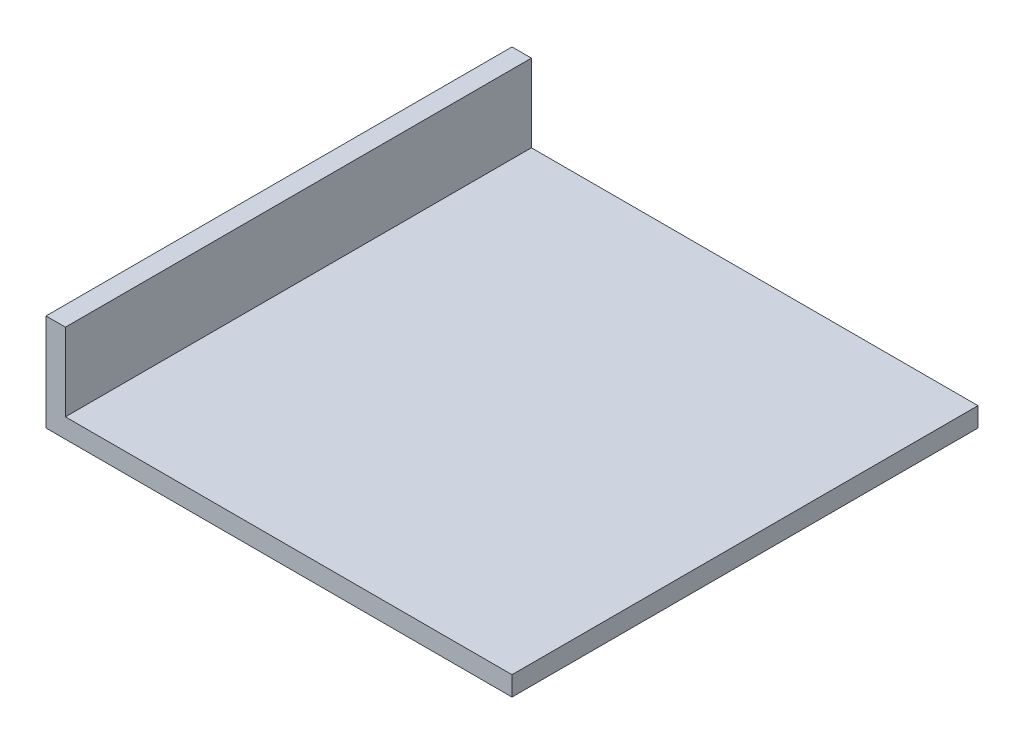
ISO-10303-21;
HEADER;
FILE_DESCRIPTION(('STEP AP214'),'2;1');
FILE_NAME('part.step','',(''),(''),'','','');
FILE_SCHEMA(('AUTOMOTIVE_DESIGN { 1 0 10303 214 1 1 1 1 }'));
ENDSEC;
DATA;
#1=APPLICATION_CONTEXT('core data for automotive mechanical design processes');
#2=APPLICATION_PROTOCOL_DEFINITION('international standard','automotive_design',2000,#1);
#3=PRODUCT_CONTEXT('',#1,'mechanical');
#4=PRODUCT('Part','Part','',(#3));
#5=PRODUCT_RELATED_PRODUCT_CATEGORY('part','',(#4));
#6=PRODUCT_DEFINITION_FORMATION('','',#4);
#7=PRODUCT_DEFINITION_CONTEXT('part definition',#1,'design');
#8=PRODUCT_DEFINITION('design','',#6,#7);
#9=PRODUCT_DEFINITION_SHAPE('','',#8);
#10=(LENGTH_UNIT() NAMED_UNIT(*) SI_UNIT(.MILLI.,.METRE.));
#11=(NAMED_UNIT(*) PLANE_ANGLE_UNIT() SI_UNIT($,.RADIAN.));
#12=(NAMED_UNIT(*) SI_UNIT($,.STERADIAN.) SOLID_ANGLE_UNIT());
#13=UNCERTAINTY_MEASURE_WITH_UNIT(LENGTH_MEASURE(1.E-05),#10,'distance_accuracy_value','');
#14=(GEOMETRIC_REPRESENTATION_CONTEXT(3) GLOBAL_UNCERTAINTY_ASSIGNED_CONTEXT((#13)) GLOBAL_UNIT_ASSIGNED_CONTEXT((#10,
#11,#12)) REPRESENTATION_CONTEXT('',''));
#15=CARTESIAN_POINT('',(0.,0.,0.));
#16=DIRECTION('',(0.,0.,1.));
#17=DIRECTION('',(1.,0.,0.));
#18=AXIS2_PLACEMENT_3D('',#15,#16,#17);
#19=CARTESIAN_POINT('',(0.,25.4,0.));
#20=DIRECTION('',(0.,-1.,0.));
#21=DIRECTION('',(0.,0.,-1.));
#22=AXIS2_PLACEMENT_3D('',#19,#20,#21);
#23=PLANE('',#22);
#24=DIRECTION('',(0.,0.,-1.));
#25=VECTOR('',#24,1.);
#26=CARTESIAN_POINT('',(-279.4,25.4,-304.8));
#27=LINE('',#26,#25);
#28=CARTESIAN_POINT('',(-279.4,25.4,304.8));
#29=VERTEX_POINT('',#28);
#30=CARTESIAN_POINT('',(-279.4,25.4,-304.8));
#31=VERTEX_POINT('',#30);
#32=EDGE_CURVE('E48',#29,#31,#27,.T.);
#33=ORIENTED_EDGE('',*,*,#32,.F.);
#34=DIRECTION('',(1.,0.,0.));
#35=VECTOR('',#34,1.);
#36=CARTESIAN_POINT('',(-304.8,25.4,304.8));
#37=LINE('',#36,#35);
#38=CARTESIAN_POINT('',(304.8,25.4,304.8));
#39=VERTEX_POINT('',#38);
#40=EDGE_CURVE('E53',#29,#39,#37,.T.);
#41=ORIENTED_EDGE('',*,*,#40,.T.);
#42=DIRECTION('',(0.,0.,-1.));
#43=VECTOR('',#42,1.);
#44=CARTESIAN_POINT('',(304.8,25.4,304.8));
#45=LINE('',#44,#43);
#46=CARTESIAN_POINT('',(304.8,25.4,-304.8));
#47=VERTEX_POINT('',#46);
#48=EDGE_CURVE('E84',#39,#47,#45,.T.);
#49=ORIENTED_EDGE('',*,*,#48,.T.);
#50=DIRECTION('',(-1.,0.,0.));
#51=VECTOR('',#50,1.);
#52=CARTESIAN_POINT('',(-304.8,25.4,-304.8));
#53=LINE('',#52,#51);
#54=EDGE_CURVE('E134',#47,#31,#53,.T.);
#55=ORIENTED_EDGE('',*,*,#54,.T.);
#56=EDGE_LOOP('',(#33,#41,#49,#55));
#57=FACE_BOUND('',#56,.T.);
#58=ADVANCED_FACE('F33',(#57),#23,.F.);
#59=CARTESIAN_POINT('',(304.8,25.4,304.8));
#60=DIRECTION('',(-1.,0.,0.));
#61=DIRECTION('',(0.,0.,1.));
#62=AXIS2_PLACEMENT_3D('',#59,#60,#61);
#63=PLANE('',#62);
#64=DIRECTION('',(0.,0.,-1.));
#65=VECTOR('',#64,1.);
#66=CARTESIAN_POINT('',(304.8,0.,304.8));
#67=LINE('',#66,#65);
#68=CARTESIAN_POINT('',(304.8,0.,304.8));
#69=VERTEX_POINT('',#68);
#70=CARTESIAN_POINT('',(304.8,0.,-304.8));
#71=VERTEX_POINT('',#70);
#72=EDGE_CURVE('E90',#69,#71,#67,.T.);
#73=ORIENTED_EDGE('',*,*,#72,.T.);
#74=DIRECTION('',(0.,-1.,0.));
#75=VECTOR('',#74,1.);
#76=CARTESIAN_POINT('',(304.8,25.4,-304.8));
#77=LINE('',#76,#75);
#78=EDGE_CURVE('E11',#47,#71,#77,.T.);
#79=ORIENTED_EDGE('',*,*,#78,.F.);
#80=ORIENTED_EDGE('',*,*,#48,.F.);
#81=DIRECTION('',(0.,-1.,0.));
#82=VECTOR('',#81,1.);
#83=CARTESIAN_POINT('',(304.8,25.4,304.8));
#84=LINE('',#83,#82);
#85=EDGE_CURVE('E76',#39,#69,#84,.T.);
#86=ORIENTED_EDGE('',*,*,#85,.T.);
#87=EDGE_LOOP('',(#73,#79,#80,#86));
#88=FACE_BOUND('',#87,.T.);
#89=ADVANCED_FACE('F35',(#88),#63,.F.);
#90=CARTESIAN_POINT('',(-304.8,25.4,-304.8));
#91=DIRECTION('',(0.,0.,1.));
#92=DIRECTION('',(1.,0.,0.));
#93=AXIS2_PLACEMENT_3D('',#90,#91,#92);
#94=PLANE('',#93);
#95=DIRECTION('',(-1.,0.,0.));
#96=VECTOR('',#95,1.);
#97=CARTESIAN_POINT('',(-304.8,0.,-304.8));
#98=LINE('',#97,#96);
#99=CARTESIAN_POINT('',(-304.8,0.,-304.8));
#100=VERTEX_POINT('',#99);
#101=EDGE_CURVE('E93',#71,#100,#98,.T.);
#102=ORIENTED_EDGE('',*,*,#101,.T.);
#103=DIRECTION('',(0.,-1.,0.));
#104=VECTOR('',#103,1.);
#105=CARTESIAN_POINT('',(-304.8,25.4,-304.8));
#106=LINE('',#105,#104);
#107=CARTESIAN_POINT('',(-304.8,127.,-304.8));
#108=VERTEX_POINT('',#107);
#109=EDGE_CURVE('E41',#108,#100,#106,.T.);
#110=ORIENTED_EDGE('',*,*,#109,.F.);
#111=DIRECTION('',(-1.,0.,0.));
#112=VECTOR('',#111,1.);
#113=CARTESIAN_POINT('',(-304.8,127.,-304.8));
#114=LINE('',#113,#112);
#115=CARTESIAN_POINT('',(-279.4,127.,-304.8));
#116=VERTEX_POINT('',#115);
#117=EDGE_CURVE('E117',#116,#108,#114,.T.);
#118=ORIENTED_EDGE('',*,*,#117,.F.);
#119=DIRECTION('',(0.,-1.,0.));
#120=VECTOR('',#119,1.);
#121=CARTESIAN_POINT('',(-279.4,127.,-304.8));
#122=LINE('',#121,#120);
#123=EDGE_CURVE('E98',#116,#31,#122,.T.);
#124=ORIENTED_EDGE('',*,*,#123,.T.);
#125=ORIENTED_EDGE('',*,*,#54,.F.);
#126=ORIENTED_EDGE('',*,*,#78,.T.);
#127=EDGE_LOOP('',(#102,#110,#118,#124,#125,#126));
#128=FACE_BOUND('',#127,.T.);
#129=ADVANCED_FACE('F114',(#128),#94,.F.);
#130=CARTESIAN_POINT('',(-304.8,25.4,304.8));
#131=DIRECTION('',(1.,0.,0.));
#132=DIRECTION('',(0.,0.,-1.));
#133=AXIS2_PLACEMENT_3D('',#130,#131,#132);
#134=PLANE('',#133);
#135=DIRECTION('',(0.,0.,1.));
#136=VECTOR('',#135,1.);
#137=CARTESIAN_POINT('',(-304.8,0.,304.8));
#138=LINE('',#137,#136);
#139=CARTESIAN_POINT('',(-304.8,0.,304.8));
#140=VERTEX_POINT('',#139);
#141=EDGE_CURVE('E85',#100,#140,#138,.T.);
#142=ORIENTED_EDGE('',*,*,#141,.T.);
#143=DIRECTION('',(0.,-1.,0.));
#144=VECTOR('',#143,1.);
#145=CARTESIAN_POINT('',(-304.8,25.4,304.8));
#146=LINE('',#145,#144);
#147=CARTESIAN_POINT('',(-304.8,127.,304.8));
#148=VERTEX_POINT('',#147);
#149=EDGE_CURVE('E80',#148,#140,#146,.T.);
#150=ORIENTED_EDGE('',*,*,#149,.F.);
#151=DIRECTION('',(0.,0.,1.));
#152=VECTOR('',#151,1.);
#153=CARTESIAN_POINT('',(-304.8,127.,-304.8));
#154=LINE('',#153,#152);
#155=EDGE_CURVE('E110',#108,#148,#154,.T.);
#156=ORIENTED_EDGE('',*,*,#155,.F.);
#157=ORIENTED_EDGE('',*,*,#109,.T.);
#158=EDGE_LOOP('',(#142,#150,#156,#157));
#159=FACE_BOUND('',#158,.T.);
#160=ADVANCED_FACE('F108',(#159),#134,.F.);
#161=CARTESIAN_POINT('',(-304.8,25.4,304.8));
#162=DIRECTION('',(0.,0.,-1.));
#163=DIRECTION('',(-1.,0.,0.));
#164=AXIS2_PLACEMENT_3D('',#161,#162,#163);
#165=PLANE('',#164);
#166=DIRECTION('',(1.,0.,0.));
#167=VECTOR('',#166,1.);
#168=CARTESIAN_POINT('',(-304.8,0.,304.8));
#169=LINE('',#168,#167);
#170=EDGE_CURVE('E73',#140,#69,#169,.T.);
#171=ORIENTED_EDGE('',*,*,#170,.T.);
#172=ORIENTED_EDGE('',*,*,#85,.F.);
#173=ORIENTED_EDGE('',*,*,#40,.F.);
#174=DIRECTION('',(0.,-1.,0.));
#175=VECTOR('',#174,1.);
#176=CARTESIAN_POINT('',(-279.4,127.,304.8));
#177=LINE('',#176,#175);
#178=CARTESIAN_POINT('',(-279.4,127.,304.8));
#179=VERTEX_POINT('',#178);
#180=EDGE_CURVE('E94',#179,#29,#177,.T.);
#181=ORIENTED_EDGE('',*,*,#180,.F.);
#182=DIRECTION('',(1.,0.,0.));
#183=VECTOR('',#182,1.);
#184=CARTESIAN_POINT('',(-304.8,127.,304.8));
#185=LINE('',#184,#183);
#186=EDGE_CURVE('E129',#148,#179,#185,.T.);
#187=ORIENTED_EDGE('',*,*,#186,.F.);
#188=ORIENTED_EDGE('',*,*,#149,.T.);
#189=EDGE_LOOP('',(#171,#172,#173,#181,#187,#188));
#190=FACE_BOUND('',#189,.T.);
#191=ADVANCED_FACE('F75',(#190),#165,.F.);
#192=CARTESIAN_POINT('',(0.,0.,0.));
#193=DIRECTION('',(0.,-1.,0.));
#194=DIRECTION('',(0.,0.,-1.));
#195=AXIS2_PLACEMENT_3D('',#192,#193,#194);
#196=PLANE('',#195);
#197=ORIENTED_EDGE('',*,*,#72,.F.);
#198=ORIENTED_EDGE('',*,*,#170,.F.);
#199=ORIENTED_EDGE('',*,*,#141,.F.);
#200=ORIENTED_EDGE('',*,*,#101,.F.);
#201=EDGE_LOOP('',(#197,#198,#199,#200));
#202=FACE_BOUND('',#201,.T.);
#203=ADVANCED_FACE('F92',(#202),#196,.T.);
#204=CARTESIAN_POINT('',(-279.4,127.,-304.8));
#205=DIRECTION('',(-1.,0.,0.));
#206=DIRECTION('',(0.,0.,1.));
#207=AXIS2_PLACEMENT_3D('',#204,#205,#206);
#208=PLANE('',#207);
#209=ORIENTED_EDGE('',*,*,#32,.T.);
#210=ORIENTED_EDGE('',*,*,#123,.F.);
#211=DIRECTION('',(0.,0.,-1.));
#212=VECTOR('',#211,1.);
#213=CARTESIAN_POINT('',(-279.4,127.,-304.8));
#214=LINE('',#213,#212);
#215=EDGE_CURVE('E125',#179,#116,#214,.T.);
#216=ORIENTED_EDGE('',*,*,#215,.F.);
#217=ORIENTED_EDGE('',*,*,#180,.T.);
#218=EDGE_LOOP('',(#209,#210,#216,#217));
#219=FACE_BOUND('',#218,.T.);
#220=ADVANCED_FACE('F137',(#219),#208,.F.);
#221=CARTESIAN_POINT('',(0.,127.,0.));
#222=DIRECTION('',(0.,1.,0.));
#223=DIRECTION('',(0.,0.,1.));
#224=AXIS2_PLACEMENT_3D('',#221,#222,#223);
#225=PLANE('',#224);
#226=ORIENTED_EDGE('',*,*,#155,.T.);
#227=ORIENTED_EDGE('',*,*,#186,.T.);
#228=ORIENTED_EDGE('',*,*,#215,.T.);
#229=ORIENTED_EDGE('',*,*,#117,.T.);
#230=EDGE_LOOP('',(#226,#227,#228,#229));
#231=FACE_BOUND('',#230,.T.);
#232=ADVANCED_FACE('F121',(#231),#225,.T.);
#233=CLOSED_SHELL('',(#58,#89,#129,#160,#191,#203,#220,#232));
#234=MANIFOLD_SOLID_BREP('B2',#233);
#235=ADVANCED_BREP_SHAPE_REPRESENTATION('',(#18,#234),#14);
#236=SHAPE_DEFINITION_REPRESENTATION(#9,#235);
ENDSEC;
END-ISO-10303-21;
